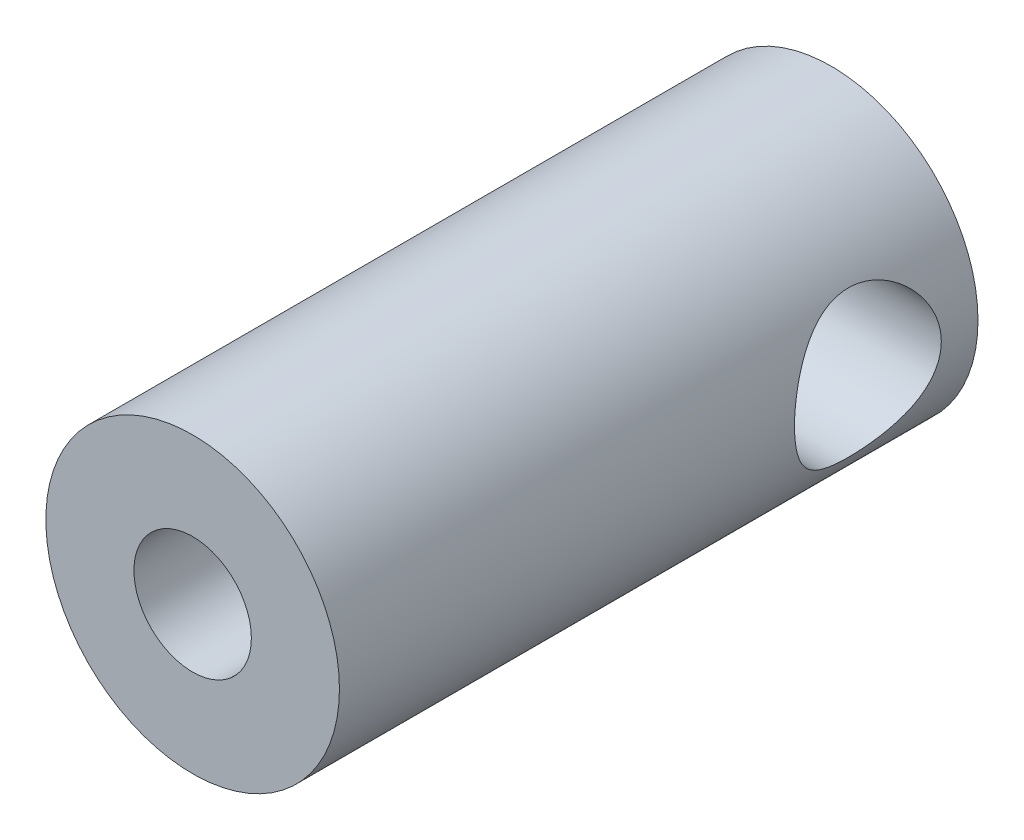
ISO-10303-21;
HEADER;
FILE_DESCRIPTION(('STEP AP214'),'2;1');
FILE_NAME('part.step','',(''),(''),'','','');
FILE_SCHEMA(('AUTOMOTIVE_DESIGN { 1 0 10303 214 1 1 1 1 }'));
ENDSEC;
DATA;
#1=APPLICATION_CONTEXT('core data for automotive mechanical design processes');
#2=APPLICATION_PROTOCOL_DEFINITION('international standard','automotive_design',2000,#1);
#3=PRODUCT_CONTEXT('',#1,'mechanical');
#4=PRODUCT('Part','Part','',(#3));
#5=PRODUCT_RELATED_PRODUCT_CATEGORY('part','',(#4));
#6=PRODUCT_DEFINITION_FORMATION('','',#4);
#7=PRODUCT_DEFINITION_CONTEXT('part definition',#1,'design');
#8=PRODUCT_DEFINITION('design','',#6,#7);
#9=PRODUCT_DEFINITION_SHAPE('','',#8);
#10=(LENGTH_UNIT() NAMED_UNIT(*) SI_UNIT(.MILLI.,.METRE.));
#11=(NAMED_UNIT(*) PLANE_ANGLE_UNIT() SI_UNIT($,.RADIAN.));
#12=(NAMED_UNIT(*) SI_UNIT($,.STERADIAN.) SOLID_ANGLE_UNIT());
#13=UNCERTAINTY_MEASURE_WITH_UNIT(LENGTH_MEASURE(1.E-05),#10,'distance_accuracy_value','');
#14=(GEOMETRIC_REPRESENTATION_CONTEXT(3) GLOBAL_UNCERTAINTY_ASSIGNED_CONTEXT((#13)) GLOBAL_UNIT_ASSIGNED_CONTEXT((#10,
#11,#12)) REPRESENTATION_CONTEXT('',''));
#15=CARTESIAN_POINT('',(0.,0.,0.));
#16=DIRECTION('',(0.,0.,1.));
#17=DIRECTION('',(1.,0.,0.));
#18=AXIS2_PLACEMENT_3D('',#15,#16,#17);
#19=CARTESIAN_POINT('',(0.,0.,27.6225));
#20=DIRECTION('',(0.,0.,-1.));
#21=DIRECTION('',(-1.,0.,0.));
#22=AXIS2_PLACEMENT_3D('',#19,#20,#21);
#23=CYLINDRICAL_SURFACE('',#22,6.35);
#24=CARTESIAN_POINT('',(-6.35,0.,1.5875));
#25=CARTESIAN_POINT('',(-6.34999931166444,0.0834969220594999,1.58750088771763));
#26=CARTESIAN_POINT('',(-6.34834758911701,0.167002655580042,1.59079987444595));
#27=CARTESIAN_POINT('',(-6.34179105821715,0.333378330258781,1.60394587454989));
#28=CARTESIAN_POINT('',(-6.33688483467113,0.416247978955772,1.61379573652577));
#29=CARTESIAN_POINT('',(-6.31742426748325,0.66318203064701,1.65307206504601));
#30=CARTESIAN_POINT('',(-6.29812827299425,0.825450146761554,1.6922250774014));
#31=CARTESIAN_POINT('',(-6.2489182313574,1.13965128900426,1.79449071129415));
#32=CARTESIAN_POINT('',(-6.21904547786825,1.29162180811868,1.85751021924341));
#33=CARTESIAN_POINT('',(-6.15142812041637,1.58264035037879,2.0052360736289));
#34=CARTESIAN_POINT('',(-6.11368413715877,1.72168939123018,2.08994071015096));
#35=CARTESIAN_POINT('',(-6.03111096182982,1.99234108848171,2.28446962973422));
#36=CARTESIAN_POINT('',(-5.98599127270818,2.12298433900091,2.39550357779393));
#37=CARTESIAN_POINT('',(-5.89470535591056,2.36467069069853,2.63689668357279));
#38=CARTESIAN_POINT('',(-5.84853836069043,2.47569885601321,2.76727042976644));
#39=CARTESIAN_POINT('',(-5.75623634934464,2.68368848497886,3.05592094775331));
#40=CARTESIAN_POINT('',(-5.71038146176788,2.77889135161934,3.21557753130159));
#41=CARTESIAN_POINT('',(-5.64919759286363,2.90019349951534,3.46704798717443));
#42=CARTESIAN_POINT('',(-5.63006420805933,2.93705266116892,3.55290006182868));
#43=CARTESIAN_POINT('',(-5.59504604853267,3.00322508739606,3.72808561370642));
#44=CARTESIAN_POINT('',(-5.57915935583429,3.03254280972159,3.81741699818055));
#45=CARTESIAN_POINT('',(-5.55212611635049,3.08174263292982,3.99351055196474));
#46=CARTESIAN_POINT('',(-5.54075429137746,3.10208128111978,4.08011079402856));
#47=CARTESIAN_POINT('',(-5.52193654886444,3.13545600360765,4.2550872789944));
#48=CARTESIAN_POINT('',(-5.51448854851135,3.14849595237257,4.3434625537717));
#49=CARTESIAN_POINT('',(-5.50383875782918,3.1670771305344,4.52120673884862));
#50=CARTESIAN_POINT('',(-5.50063441026522,3.1726228759965,4.6105750179874));
#51=CARTESIAN_POINT('',(-5.49859788398609,3.17614778806993,4.78948078417809));
#52=CARTESIAN_POINT('',(-5.49976528812799,3.17412767659872,4.87901825427134));
#53=CARTESIAN_POINT('',(-5.50899190362733,3.1581193033026,5.12524787572441));
#54=CARTESIAN_POINT('',(-5.52160857357707,3.13621253452965,5.28134172981337));
#55=CARTESIAN_POINT('',(-5.55866493052824,3.07003746372168,5.58714664130653));
#56=CARTESIAN_POINT('',(-5.58310838358077,3.02576203854504,5.73685564902276));
#57=CARTESIAN_POINT('',(-5.64157885407237,2.91531509833647,6.03004429656414));
#58=CARTESIAN_POINT('',(-5.67581583876129,2.84865758129418,6.17329760993662));
#59=CARTESIAN_POINT('',(-5.75003268807633,2.69570761526054,6.44726608617402));
#60=CARTESIAN_POINT('',(-5.79001512927804,2.60940634674629,6.57797557960851));
#61=CARTESIAN_POINT('',(-5.87734289018611,2.40685964249565,6.84060427425029));
#62=CARTESIAN_POINT('',(-5.92497898403936,2.28820488335253,6.97057538485651));
#63=CARTESIAN_POINT('',(-6.01813700574905,2.03058898448427,7.20958514286384));
#64=CARTESIAN_POINT('',(-6.06365791538158,1.89161819563546,7.3186137863587));
#65=CARTESIAN_POINT('',(-6.1500381059768,1.58913989972483,7.51740191971972));
#66=CARTESIAN_POINT('',(-6.19058274974572,1.42479265164788,7.60603148557994));
#67=CARTESIAN_POINT('',(-6.25976272299952,1.08098023585583,7.75365808163535));
#68=CARTESIAN_POINT('',(-6.28840750578946,0.901527205073896,7.81267864113171));
#69=CARTESIAN_POINT('',(-6.32854759690358,0.548533610626833,7.89455940339905));
#70=CARTESIAN_POINT('',(-6.34126679122995,0.375734359385244,7.92000967258734));
#71=CARTESIAN_POINT('',(-6.35231817716325,0.0278752299448313,7.94215052226026));
#72=CARTESIAN_POINT('',(-6.35065718436129,-0.147183538060019,7.93885472713932));
#73=CARTESIAN_POINT('',(-6.33384535408399,-0.480164686080362,7.90509376405461));
#74=CARTESIAN_POINT('',(-6.31975005060431,-0.638363620564189,7.87675420852516));
#75=CARTESIAN_POINT('',(-6.28085393924121,-0.947441883053,7.7970441217901));
#76=CARTESIAN_POINT('',(-6.25605195113515,-1.09832040207141,7.74567105152271));
#77=CARTESIAN_POINT('',(-6.19709998236334,-1.39347133182512,7.6200048690622));
#78=CARTESIAN_POINT('',(-6.16270299610717,-1.53743151047822,7.54509841588881));
#79=CARTESIAN_POINT('',(-6.08787118465664,-1.8112148234104,7.37518357431413));
#80=CARTESIAN_POINT('',(-6.0474337895468,-1.94103189959927,7.2801666226146));
#81=CARTESIAN_POINT('',(-5.95973602709939,-2.19636241342679,7.06196064962623));
#82=CARTESIAN_POINT('',(-5.91219559251098,-2.3202013468198,6.93692139288843));
#83=CARTESIAN_POINT('',(-5.81858093231368,-2.54589381918874,6.66773764485025));
#84=CARTESIAN_POINT('',(-5.77250773963547,-2.6477321493525,6.52358004761907));
#85=CARTESIAN_POINT('',(-5.68487535288742,-2.83117262876716,6.21143139804165));
#86=CARTESIAN_POINT('',(-5.64364281441821,-2.91155594998014,6.04262423048961));
#87=CARTESIAN_POINT('',(-5.5744767953732,-3.04191297152938,5.69115553511033));
#88=CARTESIAN_POINT('',(-5.54652618900869,-3.0919258549222,5.50851220215262));
#89=CARTESIAN_POINT('',(-5.51057765714603,-3.15551086037918,5.15331004352983));
#90=CARTESIAN_POINT('',(-5.50092192343245,-3.17212027309711,4.98146624959279));
#91=CARTESIAN_POINT('',(-5.49800001145358,-3.17718805563876,4.6372555575048));
#92=CARTESIAN_POINT('',(-5.50472672904441,-3.16565862768386,4.46488891845736));
#93=CARTESIAN_POINT('',(-5.53205211477784,-3.11761548073658,4.14183989692609));
#94=CARTESIAN_POINT('',(-5.55126823076269,-3.08358651207686,3.99065605826885));
#95=CARTESIAN_POINT('',(-5.59977978302582,-2.99458164828807,3.69630916983283));
#96=CARTESIAN_POINT('',(-5.62907846127335,-2.93959901505999,3.5531487171497));
#97=CARTESIAN_POINT('',(-5.69685576337174,-2.8061154442137,3.26826630057145));
#98=CARTESIAN_POINT('',(-5.73581889480533,-2.72628260503929,3.12728719063433));
#99=CARTESIAN_POINT('',(-5.81772207082382,-2.54682759156583,2.8598025682769));
#100=CARTESIAN_POINT('',(-5.8606641782013,-2.44719512169931,2.73330464005729));
#101=CARTESIAN_POINT('',(-5.95192753761203,-2.21680287661219,2.48240247582294));
#102=CARTESIAN_POINT('',(-6.00026839877346,-2.08373188558712,2.36012024358721));
#103=CARTESIAN_POINT('',(-6.0921234557675,-1.79751265125244,2.13910212676688));
#104=CARTESIAN_POINT('',(-6.13563504323043,-1.64435365457428,2.04037893401728));
#105=CARTESIAN_POINT('',(-6.19391073190243,-1.40178715704487,1.91221973380293));
#106=CARTESIAN_POINT('',(-6.21223173271383,-1.31842200030918,1.87269941631861));
#107=CARTESIAN_POINT('',(-6.24595363475604,-1.1480770102167,1.8009005251763));
#108=CARTESIAN_POINT('',(-6.26135597012704,-1.06109897786306,1.76861839346563));
#109=CARTESIAN_POINT('',(-6.28875097111981,-0.884361322813107,1.711740654085));
#110=CARTESIAN_POINT('',(-6.30075106809478,-0.794608244970571,1.68712828186189));
#111=CARTESIAN_POINT('',(-6.32100983571903,-0.612925661591581,1.64583261047011));
#112=CARTESIAN_POINT('',(-6.3292707916836,-0.52099752168029,1.62914446780645));
#113=CARTESIAN_POINT('',(-6.34032503263334,-0.357531347524375,1.60688371513761));
#114=CARTESIAN_POINT('',(-6.34394670812889,-0.286274046488597,1.59962117875037));
#115=CARTESIAN_POINT('',(-6.34878452045567,-0.143346668941348,1.58992887346243));
#116=CARTESIAN_POINT('',(-6.35000059089052,-0.0716765810914262,1.58749923795317));
#117=CARTESIAN_POINT('',(-6.35,0.,1.5875));
#118=B_SPLINE_CURVE_WITH_KNOTS('',3,(#24,#25,#26,#27,#28,#29,#30,#31,#32,#33,#34,#35,#36,#37,
#38,#39,#40,#41,#42,#43,#44,#45,#46,#47,#48,#49,#50,#51,#52,#53,#54,#55,#56,#57,#58,#59,#60,#61,
#62,#63,#64,#65,#66,#67,#68,#69,#70,#71,#72,#73,#74,#75,#76,#77,#78,#79,#80,#81,#82,#83,#84,#85,
#86,#87,#88,#89,#90,#91,#92,#93,#94,#95,#96,#97,#98,#99,#100,#101,#102,#103,#104,#105,#106,#107,
#108,#109,#110,#111,#112,#113,#114,#115,#116,#117),.UNSPECIFIED.,.T.,.F.,(4,2,2,2,2,2,2,2,2,2,2,
2,2,2,2,2,2,2,2,2,2,2,2,2,2,2,2,2,2,2,2,2,2,2,2,2,2,2,2,2,2,2,2,2,2,2,4),(0.,0.25041561210268,
0.500940186864014,1.00234854488129,1.50182051324263,2.00125310940106,2.53090025348452,
3.06094897410615,3.63210298373098,3.91787290005988,4.20347350732849,4.47213270490102,
4.74064915090148,5.00900371453887,5.27733267302576,5.74927594687739,6.22136960256846,
6.70445970327764,7.18776712794021,7.73235646527881,8.27720530143646,8.84735553323666,
9.41705196489304,9.93956405039339,10.4618285011675,10.9436138594975,11.4254523397102,
11.9210677568139,12.4168946391879,12.9614122158798,13.5063050164601,14.0775857365549,
14.6481278321882,15.1639000911419,15.6794487286237,16.1458838633213,16.6124691169503,
17.1104020806943,17.6085946442304,18.1673210354482,18.7263477502426,19.0082017078365,
19.2899168101042,19.5710117490933,19.8519346536844,20.0668939492148,20.2818591776892),.UNSPECIFIED.);
#119=CARTESIAN_POINT('',(-6.35,0.,1.5875));
#120=VERTEX_POINT('',#119);
#121=EDGE_CURVE('E10',#120,#120,#118,.T.);
#122=ORIENTED_EDGE('',*,*,#121,.T.);
#123=EDGE_LOOP('',(#122));
#124=FACE_BOUND('',#123,.T.);
#125=CARTESIAN_POINT('',(6.35,0.,1.5875));
#126=CARTESIAN_POINT('',(6.34999931166444,-0.0834969220594999,1.58750088771763));
#127=CARTESIAN_POINT('',(6.34834758911701,-0.167002655580042,1.59079987444595));
#128=CARTESIAN_POINT('',(6.34179105821715,-0.333378330258781,1.60394587454989));
#129=CARTESIAN_POINT('',(6.33688483467113,-0.416247978955772,1.61379573652577));
#130=CARTESIAN_POINT('',(6.31742426748325,-0.66318203064701,1.65307206504601));
#131=CARTESIAN_POINT('',(6.29812827299425,-0.825450146761554,1.6922250774014));
#132=CARTESIAN_POINT('',(6.2489182313574,-1.13965128900426,1.79449071129415));
#133=CARTESIAN_POINT('',(6.21904547786825,-1.29162180811868,1.85751021924341));
#134=CARTESIAN_POINT('',(6.15142812041637,-1.58264035037879,2.0052360736289));
#135=CARTESIAN_POINT('',(6.11368413715877,-1.72168939123018,2.08994071015096));
#136=CARTESIAN_POINT('',(6.03111096182982,-1.99234108848171,2.28446962973422));
#137=CARTESIAN_POINT('',(5.98599127270818,-2.12298433900091,2.39550357779393));
#138=CARTESIAN_POINT('',(5.89470535591056,-2.36467069069853,2.63689668357279));
#139=CARTESIAN_POINT('',(5.84853836069043,-2.47569885601321,2.76727042976644));
#140=CARTESIAN_POINT('',(5.75623634934464,-2.68368848497886,3.05592094775331));
#141=CARTESIAN_POINT('',(5.71038146176788,-2.77889135161934,3.21557753130159));
#142=CARTESIAN_POINT('',(5.64919759286363,-2.90019349951534,3.46704798717443));
#143=CARTESIAN_POINT('',(5.63006420805933,-2.93705266116892,3.55290006182868));
#144=CARTESIAN_POINT('',(5.59504604853267,-3.00322508739606,3.72808561370642));
#145=CARTESIAN_POINT('',(5.57915935583429,-3.03254280972159,3.81741699818055));
#146=CARTESIAN_POINT('',(5.55212611635049,-3.08174263292982,3.99351055196474));
#147=CARTESIAN_POINT('',(5.54075429137746,-3.10208128111978,4.08011079402856));
#148=CARTESIAN_POINT('',(5.52193654886444,-3.13545600360765,4.2550872789944));
#149=CARTESIAN_POINT('',(5.51448854851135,-3.14849595237257,4.3434625537717));
#150=CARTESIAN_POINT('',(5.50383875782918,-3.1670771305344,4.52120673884862));
#151=CARTESIAN_POINT('',(5.50063441026522,-3.1726228759965,4.6105750179874));
#152=CARTESIAN_POINT('',(5.49859788398609,-3.17614778806993,4.78948078417809));
#153=CARTESIAN_POINT('',(5.49976528812799,-3.17412767659872,4.87901825427134));
#154=CARTESIAN_POINT('',(5.50899190362733,-3.1581193033026,5.12524787572441));
#155=CARTESIAN_POINT('',(5.52160857357707,-3.13621253452965,5.28134172981337));
#156=CARTESIAN_POINT('',(5.55866493052824,-3.07003746372168,5.58714664130653));
#157=CARTESIAN_POINT('',(5.58310838358077,-3.02576203854504,5.73685564902276));
#158=CARTESIAN_POINT('',(5.64157885407237,-2.91531509833647,6.03004429656414));
#159=CARTESIAN_POINT('',(5.67581583876129,-2.84865758129418,6.17329760993662));
#160=CARTESIAN_POINT('',(5.75003268807633,-2.69570761526054,6.44726608617402));
#161=CARTESIAN_POINT('',(5.79001512927804,-2.60940634674629,6.57797557960851));
#162=CARTESIAN_POINT('',(5.87734289018611,-2.40685964249565,6.84060427425029));
#163=CARTESIAN_POINT('',(5.92497898403936,-2.28820488335253,6.97057538485651));
#164=CARTESIAN_POINT('',(6.01813700574905,-2.03058898448427,7.20958514286384));
#165=CARTESIAN_POINT('',(6.06365791538158,-1.89161819563546,7.3186137863587));
#166=CARTESIAN_POINT('',(6.1500381059768,-1.58913989972483,7.51740191971972));
#167=CARTESIAN_POINT('',(6.19058274974572,-1.42479265164788,7.60603148557994));
#168=CARTESIAN_POINT('',(6.25976272299952,-1.08098023585583,7.75365808163535));
#169=CARTESIAN_POINT('',(6.28840750578946,-0.901527205073896,7.81267864113171));
#170=CARTESIAN_POINT('',(6.32854759690358,-0.548533610626833,7.89455940339905));
#171=CARTESIAN_POINT('',(6.34126679122995,-0.375734359385244,7.92000967258734));
#172=CARTESIAN_POINT('',(6.35231817716325,-0.0278752299448313,7.94215052226026));
#173=CARTESIAN_POINT('',(6.35065718436129,0.147183538060019,7.93885472713932));
#174=CARTESIAN_POINT('',(6.33384535408399,0.480164686080362,7.90509376405461));
#175=CARTESIAN_POINT('',(6.31975005060431,0.638363620564189,7.87675420852516));
#176=CARTESIAN_POINT('',(6.28085393924121,0.947441883053,7.7970441217901));
#177=CARTESIAN_POINT('',(6.25605195113515,1.09832040207141,7.74567105152271));
#178=CARTESIAN_POINT('',(6.19709998236334,1.39347133182512,7.6200048690622));
#179=CARTESIAN_POINT('',(6.16270299610717,1.53743151047822,7.54509841588881));
#180=CARTESIAN_POINT('',(6.08787118465664,1.8112148234104,7.37518357431413));
#181=CARTESIAN_POINT('',(6.0474337895468,1.94103189959927,7.2801666226146));
#182=CARTESIAN_POINT('',(5.95973602709939,2.19636241342679,7.06196064962623));
#183=CARTESIAN_POINT('',(5.91219559251098,2.3202013468198,6.93692139288843));
#184=CARTESIAN_POINT('',(5.81858093231368,2.54589381918874,6.66773764485025));
#185=CARTESIAN_POINT('',(5.77250773963547,2.6477321493525,6.52358004761907));
#186=CARTESIAN_POINT('',(5.68487535288742,2.83117262876716,6.21143139804165));
#187=CARTESIAN_POINT('',(5.64364281441821,2.91155594998014,6.04262423048961));
#188=CARTESIAN_POINT('',(5.5744767953732,3.04191297152938,5.69115553511033));
#189=CARTESIAN_POINT('',(5.54652618900869,3.0919258549222,5.50851220215262));
#190=CARTESIAN_POINT('',(5.51057765714603,3.15551086037918,5.15331004352983));
#191=CARTESIAN_POINT('',(5.50092192343245,3.17212027309711,4.98146624959279));
#192=CARTESIAN_POINT('',(5.49800001145358,3.17718805563876,4.6372555575048));
#193=CARTESIAN_POINT('',(5.50472672904441,3.16565862768386,4.46488891845736));
#194=CARTESIAN_POINT('',(5.53205211477784,3.11761548073658,4.14183989692609));
#195=CARTESIAN_POINT('',(5.55126823076269,3.08358651207686,3.99065605826885));
#196=CARTESIAN_POINT('',(5.59977978302582,2.99458164828807,3.69630916983283));
#197=CARTESIAN_POINT('',(5.62907846127335,2.93959901505999,3.5531487171497));
#198=CARTESIAN_POINT('',(5.69685576337174,2.8061154442137,3.26826630057145));
#199=CARTESIAN_POINT('',(5.73581889480533,2.72628260503929,3.12728719063433));
#200=CARTESIAN_POINT('',(5.81772207082382,2.54682759156583,2.8598025682769));
#201=CARTESIAN_POINT('',(5.8606641782013,2.44719512169931,2.73330464005729));
#202=CARTESIAN_POINT('',(5.95192753761203,2.21680287661219,2.48240247582294));
#203=CARTESIAN_POINT('',(6.00026839877346,2.08373188558712,2.36012024358721));
#204=CARTESIAN_POINT('',(6.0921234557675,1.79751265125244,2.13910212676688));
#205=CARTESIAN_POINT('',(6.13563504323043,1.64435365457428,2.04037893401728));
#206=CARTESIAN_POINT('',(6.19391073190243,1.40178715704487,1.91221973380293));
#207=CARTESIAN_POINT('',(6.21223173271383,1.31842200030918,1.87269941631861));
#208=CARTESIAN_POINT('',(6.24595363475604,1.1480770102167,1.8009005251763));
#209=CARTESIAN_POINT('',(6.26135597012704,1.06109897786306,1.76861839346563));
#210=CARTESIAN_POINT('',(6.28875097111981,0.884361322813107,1.711740654085));
#211=CARTESIAN_POINT('',(6.30075106809478,0.794608244970571,1.68712828186189));
#212=CARTESIAN_POINT('',(6.32100983571903,0.612925661591581,1.64583261047011));
#213=CARTESIAN_POINT('',(6.3292707916836,0.52099752168029,1.62914446780645));
#214=CARTESIAN_POINT('',(6.34032503263334,0.357531347524375,1.60688371513761));
#215=CARTESIAN_POINT('',(6.34394670812889,0.286274046488597,1.59962117875037));
#216=CARTESIAN_POINT('',(6.34878452045567,0.143346668941348,1.58992887346243));
#217=CARTESIAN_POINT('',(6.35000059089052,0.0716765810914262,1.58749923795317));
#218=CARTESIAN_POINT('',(6.35,0.,1.5875));
#219=B_SPLINE_CURVE_WITH_KNOTS('',3,(#125,#126,#127,#128,#129,#130,#131,#132,#133,#134,#135,
#136,#137,#138,#139,#140,#141,#142,#143,#144,#145,#146,#147,#148,#149,#150,#151,#152,#153,#154,
#155,#156,#157,#158,#159,#160,#161,#162,#163,#164,#165,#166,#167,#168,#169,#170,#171,#172,#173,
#174,#175,#176,#177,#178,#179,#180,#181,#182,#183,#184,#185,#186,#187,#188,#189,#190,#191,#192,
#193,#194,#195,#196,#197,#198,#199,#200,#201,#202,#203,#204,#205,#206,#207,#208,#209,#210,#211,
#212,#213,#214,#215,#216,#217,#218),.UNSPECIFIED.,.T.,.F.,(4,2,2,2,2,2,2,2,2,2,2,2,2,2,2,2,2,2,
2,2,2,2,2,2,2,2,2,2,2,2,2,2,2,2,2,2,2,2,2,2,2,2,2,2,2,2,4),(0.,0.25041561210268,
0.500940186864014,1.00234854488129,1.50182051324263,2.00125310940106,2.53090025348452,
3.06094897410615,3.63210298373098,3.91787290005988,4.20347350732849,4.47213270490102,
4.74064915090148,5.00900371453887,5.27733267302576,5.74927594687739,6.22136960256846,
6.70445970327764,7.18776712794021,7.73235646527881,8.27720530143646,8.84735553323666,
9.41705196489304,9.93956405039339,10.4618285011675,10.9436138594975,11.4254523397102,
11.9210677568139,12.4168946391879,12.9614122158798,13.5063050164601,14.0775857365549,
14.6481278321882,15.1639000911419,15.6794487286237,16.1458838633213,16.6124691169503,
17.1104020806943,17.6085946442304,18.1673210354482,18.7263477502426,19.0082017078365,
19.2899168101042,19.5710117490933,19.8519346536844,20.0668939492148,20.2818591776892),.UNSPECIFIED.);
#220=CARTESIAN_POINT('',(6.35,0.,1.5875));
#221=VERTEX_POINT('',#220);
#222=EDGE_CURVE('E55',#221,#221,#219,.T.);
#223=ORIENTED_EDGE('',*,*,#222,.T.);
#224=EDGE_LOOP('',(#223));
#225=FACE_BOUND('',#224,.T.);
#226=CARTESIAN_POINT('',(0.,0.,27.6225));
#227=DIRECTION('',(0.,0.,1.));
#228=DIRECTION('',(1.,0.,0.));
#229=AXIS2_PLACEMENT_3D('',#226,#227,#228);
#230=CIRCLE('',#229,6.35);
#231=CARTESIAN_POINT('',(6.35,0.,27.6225));
#232=VERTEX_POINT('',#231);
#233=EDGE_CURVE('E60',#232,#232,#230,.T.);
#234=ORIENTED_EDGE('',*,*,#233,.F.);
#235=EDGE_LOOP('',(#234));
#236=FACE_BOUND('',#235,.T.);
#237=CARTESIAN_POINT('',(0.,0.,0.));
#238=DIRECTION('',(0.,0.,1.));
#239=DIRECTION('',(1.,0.,0.));
#240=AXIS2_PLACEMENT_3D('',#237,#238,#239);
#241=CIRCLE('',#240,6.35);
#242=CARTESIAN_POINT('',(6.35,0.,0.));
#243=VERTEX_POINT('',#242);
#244=EDGE_CURVE('E65',#243,#243,#241,.T.);
#245=ORIENTED_EDGE('',*,*,#244,.T.);
#246=EDGE_LOOP('',(#245));
#247=FACE_BOUND('',#246,.T.);
#248=ADVANCED_FACE('F43',(#124,#225,#236,#247),#23,.T.);
#249=CARTESIAN_POINT('',(0.,0.,27.6225));
#250=DIRECTION('',(0.,0.,1.));
#251=DIRECTION('',(1.,0.,0.));
#252=AXIS2_PLACEMENT_3D('',#249,#250,#251);
#253=PLANE('',#252);
#254=CARTESIAN_POINT('',(0.,0.,27.6225));
#255=DIRECTION('',(0.,0.,1.));
#256=DIRECTION('',(1.,0.,0.));
#257=AXIS2_PLACEMENT_3D('',#254,#255,#256);
#258=CIRCLE('',#257,2.54);
#259=CARTESIAN_POINT('',(2.54,0.,27.6225));
#260=VERTEX_POINT('',#259);
#261=EDGE_CURVE('E100',#260,#260,#258,.T.);
#262=ORIENTED_EDGE('',*,*,#261,.F.);
#263=EDGE_LOOP('',(#262));
#264=FACE_BOUND('',#263,.T.);
#265=ORIENTED_EDGE('',*,*,#233,.T.);
#266=EDGE_LOOP('',(#265));
#267=FACE_BOUND('',#266,.T.);
#268=ADVANCED_FACE('F80',(#264,#267),#253,.T.);
#269=CARTESIAN_POINT('',(0.,0.,0.));
#270=DIRECTION('',(0.,0.,1.));
#271=DIRECTION('',(1.,0.,0.));
#272=AXIS2_PLACEMENT_3D('',#269,#270,#271);
#273=PLANE('',#272);
#274=ORIENTED_EDGE('',*,*,#244,.F.);
#275=EDGE_LOOP('',(#274));
#276=FACE_BOUND('',#275,.T.);
#277=ADVANCED_FACE('F77',(#276),#273,.F.);
#278=CARTESIAN_POINT('',(-6.35,0.,4.7625));
#279=DIRECTION('',(1.,0.,0.));
#280=DIRECTION('',(0.,0.,-1.));
#281=AXIS2_PLACEMENT_3D('',#278,#279,#280);
#282=CYLINDRICAL_SURFACE('',#281,3.175);
#283=ORIENTED_EDGE('',*,*,#222,.F.);
#284=EDGE_LOOP('',(#283));
#285=FACE_BOUND('',#284,.T.);
#286=ORIENTED_EDGE('',*,*,#121,.F.);
#287=EDGE_LOOP('',(#286));
#288=FACE_BOUND('',#287,.T.);
#289=ADVANCED_FACE('F71',(#285,#288),#282,.F.);
#290=CARTESIAN_POINT('',(0.,0.,14.9225));
#291=DIRECTION('',(0.,0.,1.));
#292=DIRECTION('',(1.,0.,0.));
#293=AXIS2_PLACEMENT_3D('',#290,#291,#292);
#294=CYLINDRICAL_SURFACE('',#293,2.54);
#295=CARTESIAN_POINT('',(0.,0.,14.9225));
#296=DIRECTION('',(0.,0.,1.));
#297=DIRECTION('',(1.,0.,0.));
#298=AXIS2_PLACEMENT_3D('',#295,#296,#297);
#299=CIRCLE('',#298,2.54);
#300=CARTESIAN_POINT('',(2.54,0.,14.9225));
#301=VERTEX_POINT('',#300);
#302=EDGE_CURVE('E97',#301,#301,#299,.T.);
#303=CARTESIAN_POINT('',(2.54,0.,14.9225));
#304=CARTESIAN_POINT('',(2.54,0.,15.0547916666667));
#305=CARTESIAN_POINT('',(2.54,0.,15.1870833333333));
#306=CARTESIAN_POINT('',(2.54,0.,15.4516666666667));
#307=CARTESIAN_POINT('',(2.54,0.,15.5839583333333));
#308=CARTESIAN_POINT('',(2.54,0.,15.8485416666667));
#309=CARTESIAN_POINT('',(2.54,0.,15.9808333333333));
#310=CARTESIAN_POINT('',(2.54,0.,16.2454166666667));
#311=CARTESIAN_POINT('',(2.54,0.,16.3777083333333));
#312=CARTESIAN_POINT('',(2.54,0.,16.6422916666667));
#313=CARTESIAN_POINT('',(2.54,0.,16.7745833333333));
#314=CARTESIAN_POINT('',(2.54,0.,17.0391666666667));
#315=CARTESIAN_POINT('',(2.54,0.,17.1714583333333));
#316=CARTESIAN_POINT('',(2.54,0.,17.4360416666667));
#317=CARTESIAN_POINT('',(2.54,0.,17.5683333333333));
#318=CARTESIAN_POINT('',(2.54,0.,17.8329166666667));
#319=CARTESIAN_POINT('',(2.54,0.,17.9652083333333));
#320=CARTESIAN_POINT('',(2.54,0.,18.2297916666667));
#321=CARTESIAN_POINT('',(2.54,0.,18.3620833333333));
#322=CARTESIAN_POINT('',(2.54,0.,18.6266666666667));
#323=CARTESIAN_POINT('',(2.54,0.,18.7589583333333));
#324=CARTESIAN_POINT('',(2.54,0.,19.0235416666667));
#325=CARTESIAN_POINT('',(2.54,0.,19.1558333333333));
#326=CARTESIAN_POINT('',(2.54,0.,19.4204166666667));
#327=CARTESIAN_POINT('',(2.54,0.,19.5527083333333));
#328=CARTESIAN_POINT('',(2.54,0.,19.8172916666667));
#329=CARTESIAN_POINT('',(2.54,0.,19.9495833333333));
#330=CARTESIAN_POINT('',(2.54,0.,20.2141666666667));
#331=CARTESIAN_POINT('',(2.54,0.,20.3464583333333));
#332=CARTESIAN_POINT('',(2.54,0.,20.6110416666667));
#333=CARTESIAN_POINT('',(2.54,0.,20.7433333333333));
#334=CARTESIAN_POINT('',(2.54,0.,21.0079166666667));
#335=CARTESIAN_POINT('',(2.54,0.,21.1402083333333));
#336=CARTESIAN_POINT('',(2.54,0.,21.4047916666667));
#337=CARTESIAN_POINT('',(2.54,0.,21.5370833333333));
#338=CARTESIAN_POINT('',(2.54,0.,21.8016666666667));
#339=CARTESIAN_POINT('',(2.54,0.,21.9339583333333));
#340=CARTESIAN_POINT('',(2.54,0.,22.1985416666667));
#341=CARTESIAN_POINT('',(2.54,0.,22.3308333333333));
#342=CARTESIAN_POINT('',(2.54,0.,22.5954166666667));
#343=CARTESIAN_POINT('',(2.54,0.,22.7277083333333));
#344=CARTESIAN_POINT('',(2.54,0.,22.9922916666667));
#345=CARTESIAN_POINT('',(2.54,0.,23.1245833333333));
#346=CARTESIAN_POINT('',(2.54,0.,23.3891666666667));
#347=CARTESIAN_POINT('',(2.54,0.,23.5214583333333));
#348=CARTESIAN_POINT('',(2.54,0.,23.7860416666667));
#349=CARTESIAN_POINT('',(2.54,0.,23.9183333333333));
#350=CARTESIAN_POINT('',(2.54,0.,24.1829166666667));
#351=CARTESIAN_POINT('',(2.54,0.,24.3152083333333));
#352=CARTESIAN_POINT('',(2.54,0.,24.5797916666667));
#353=CARTESIAN_POINT('',(2.54,0.,24.7120833333333));
#354=CARTESIAN_POINT('',(2.54,0.,24.9766666666667));
#355=CARTESIAN_POINT('',(2.54,0.,25.1089583333333));
#356=CARTESIAN_POINT('',(2.54,0.,25.3735416666667));
#357=CARTESIAN_POINT('',(2.54,0.,25.5058333333333));
#358=CARTESIAN_POINT('',(2.54,0.,25.7704166666667));
#359=CARTESIAN_POINT('',(2.54,0.,25.9027083333333));
#360=CARTESIAN_POINT('',(2.54,0.,26.1672916666667));
#361=CARTESIAN_POINT('',(2.54,0.,26.2995833333333));
#362=CARTESIAN_POINT('',(2.54,0.,26.5641666666667));
#363=CARTESIAN_POINT('',(2.54,0.,26.6964583333333));
#364=CARTESIAN_POINT('',(2.54,0.,26.9610416666667));
#365=CARTESIAN_POINT('',(2.54,0.,27.0933333333333));
#366=CARTESIAN_POINT('',(2.54,0.,27.3579166666667));
#367=CARTESIAN_POINT('',(2.54,0.,27.4902083333333));
#368=CARTESIAN_POINT('',(2.54,0.,27.6225));
#369=B_SPLINE_CURVE_WITH_KNOTS('',3,(#303,#304,#305,#306,#307,#308,#309,#310,#311,#312,#313,
#314,#315,#316,#317,#318,#319,#320,#321,#322,#323,#324,#325,#326,#327,#328,#329,#330,#331,#332,
#333,#334,#335,#336,#337,#338,#339,#340,#341,#342,#343,#344,#345,#346,#347,#348,#349,#350,#351,
#352,#353,#354,#355,#356,#357,#358,#359,#360,#361,#362,#363,#364,#365,#366,#367,#368),
.UNSPECIFIED.,.F.,.F.,(4,2,2,2,2,2,2,2,2,2,2,2,2,2,2,2,2,2,2,2,2,2,2,2,2,2,2,2,2,2,2,2,4),(0.,
0.396875,0.793749999999998,1.190625,1.5875,1.984375,2.38125,2.778125,3.175,3.571875,3.96875,
4.365625,4.7625,5.159375,5.55625,5.953125,6.35,6.746875,7.14375,7.540625,7.9375,8.334375,
8.73125,9.128125,9.525,9.921875,10.31875,10.715625,11.1125,11.509375,11.90625,12.303125,12.7),.UNSPECIFIED.);
#370=EDGE_CURVE('BSEAM76',#301,#260,#369,.T.);
#371=ORIENTED_EDGE('',*,*,#302,.F.);
#372=ORIENTED_EDGE('',*,*,#261,.T.);
#373=ORIENTED_EDGE('',*,*,#370,.T.);
#374=ORIENTED_EDGE('',*,*,#370,.F.);
#375=EDGE_LOOP('',(#371,#373,#372,#374));
#376=FACE_BOUND('',#375,.T.);
#377=ADVANCED_FACE('F76',(#376),#294,.F.);
#378=CARTESIAN_POINT('',(0.,0.,14.9225));
#379=DIRECTION('',(0.,0.,1.));
#380=DIRECTION('',(1.,0.,0.));
#381=AXIS2_PLACEMENT_3D('',#378,#379,#380);
#382=PLANE('',#381);
#383=ORIENTED_EDGE('',*,*,#302,.T.);
#384=EDGE_LOOP('',(#383));
#385=FACE_BOUND('',#384,.T.);
#386=ADVANCED_FACE('F111',(#385),#382,.T.);
#387=CLOSED_SHELL('',(#248,#268,#277,#289,#377,#386));
#388=MANIFOLD_SOLID_BREP('B2',#387);
#389=ADVANCED_BREP_SHAPE_REPRESENTATION('',(#18,#388),#14);
#390=SHAPE_DEFINITION_REPRESENTATION(#9,#389);
ENDSEC;
END-ISO-10303-21;
